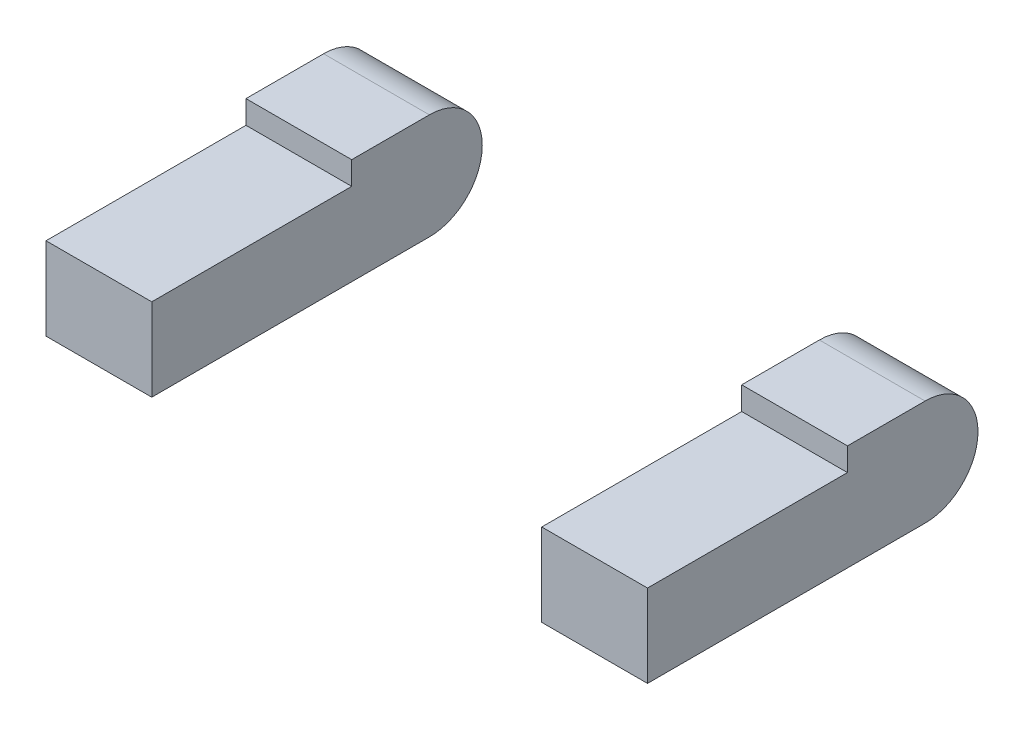
ISO-10303-21;
HEADER;
FILE_DESCRIPTION(('STEP AP214'),'2;1');
FILE_NAME('part.step','',(''),(''),'','','');
FILE_SCHEMA(('AUTOMOTIVE_DESIGN { 1 0 10303 214 1 1 1 1 }'));
ENDSEC;
DATA;
#1=APPLICATION_CONTEXT('core data for automotive mechanical design processes');
#2=APPLICATION_PROTOCOL_DEFINITION('international standard','automotive_design',2000,#1);
#3=PRODUCT_CONTEXT('',#1,'mechanical');
#4=PRODUCT('Part','Part','',(#3));
#5=PRODUCT_RELATED_PRODUCT_CATEGORY('part','',(#4));
#6=PRODUCT_DEFINITION_FORMATION('','',#4);
#7=PRODUCT_DEFINITION_CONTEXT('part definition',#1,'design');
#8=PRODUCT_DEFINITION('design','',#6,#7);
#9=PRODUCT_DEFINITION_SHAPE('','',#8);
#10=(LENGTH_UNIT() NAMED_UNIT(*) SI_UNIT(.MILLI.,.METRE.));
#11=(NAMED_UNIT(*) PLANE_ANGLE_UNIT() SI_UNIT($,.RADIAN.));
#12=(NAMED_UNIT(*) SI_UNIT($,.STERADIAN.) SOLID_ANGLE_UNIT());
#13=UNCERTAINTY_MEASURE_WITH_UNIT(LENGTH_MEASURE(1.E-05),#10,'distance_accuracy_value','');
#14=(GEOMETRIC_REPRESENTATION_CONTEXT(3) GLOBAL_UNCERTAINTY_ASSIGNED_CONTEXT((#13)) GLOBAL_UNIT_ASSIGNED_CONTEXT((#10,
#11,#12)) REPRESENTATION_CONTEXT('',''));
#15=CARTESIAN_POINT('',(0.,0.,0.));
#16=DIRECTION('',(0.,0.,1.));
#17=DIRECTION('',(1.,0.,0.));
#18=AXIS2_PLACEMENT_3D('',#15,#16,#17);
#19=CARTESIAN_POINT('',(1.82,-1.82,-3.745));
#20=DIRECTION('',(0.,0.,1.));
#21=DIRECTION('',(1.,0.,0.));
#22=AXIS2_PLACEMENT_3D('',#19,#20,#21);
#23=PLANE('',#22);
#24=DIRECTION('',(0.,-1.,0.));
#25=VECTOR('',#24,1.);
#26=CARTESIAN_POINT('',(1.82,-3.43,-3.745));
#27=LINE('',#26,#25);
#28=CARTESIAN_POINT('',(1.82,-3.43,-3.745));
#29=VERTEX_POINT('',#28);
#30=CARTESIAN_POINT('',(1.82,-3.93,-3.745));
#31=VERTEX_POINT('',#30);
#32=EDGE_CURVE('P0_E97',#29,#31,#27,.T.);
#33=ORIENTED_EDGE('',*,*,#32,.F.);
#34=DIRECTION('',(1.,0.,0.));
#35=VECTOR('',#34,1.);
#36=CARTESIAN_POINT('',(1.18,-3.43,-3.745));
#37=LINE('',#36,#35);
#38=CARTESIAN_POINT('',(1.18,-3.43,-3.745));
#39=VERTEX_POINT('',#38);
#40=EDGE_CURVE('P0_E119',#39,#29,#37,.T.);
#41=ORIENTED_EDGE('',*,*,#40,.F.);
#42=DIRECTION('',(0.,-1.,0.));
#43=VECTOR('',#42,1.);
#44=CARTESIAN_POINT('',(1.18,-3.43,-3.745));
#45=LINE('',#44,#43);
#46=CARTESIAN_POINT('',(1.18,-3.93,-3.745));
#47=VERTEX_POINT('',#46);
#48=EDGE_CURVE('P0_E73',#39,#47,#45,.T.);
#49=ORIENTED_EDGE('',*,*,#48,.T.);
#50=DIRECTION('',(-1.,0.,0.));
#51=VECTOR('',#50,1.);
#52=CARTESIAN_POINT('',(1.82,-3.93,-3.745));
#53=LINE('',#52,#51);
#54=EDGE_CURVE('P0_E11',#31,#47,#53,.T.);
#55=ORIENTED_EDGE('',*,*,#54,.F.);
#56=EDGE_LOOP('',(#33,#41,#49,#55));
#57=FACE_BOUND('',#56,.T.);
#58=ADVANCED_FACE('P0_F17',(#57),#23,.T.);
#59=CARTESIAN_POINT('',(1.82,-3.93,-3.745));
#60=DIRECTION('',(0.,-1.,0.));
#61=DIRECTION('',(0.,0.,-1.));
#62=AXIS2_PLACEMENT_3D('',#59,#60,#61);
#63=PLANE('',#62);
#64=DIRECTION('',(0.,0.,-1.));
#65=VECTOR('',#64,1.);
#66=CARTESIAN_POINT('',(1.82,-3.93,-3.745));
#67=LINE('',#66,#65);
#68=CARTESIAN_POINT('',(1.82,-3.93,-5.425));
#69=VERTEX_POINT('',#68);
#70=EDGE_CURVE('P0_E90',#31,#69,#67,.T.);
#71=ORIENTED_EDGE('',*,*,#70,.F.);
#72=ORIENTED_EDGE('',*,*,#54,.T.);
#73=DIRECTION('',(0.,0.,-1.));
#74=VECTOR('',#73,1.);
#75=CARTESIAN_POINT('',(1.18,-3.93,-3.745));
#76=LINE('',#75,#74);
#77=CARTESIAN_POINT('',(1.18,-3.93,-5.425));
#78=VERTEX_POINT('',#77);
#79=EDGE_CURVE('P0_E105',#47,#78,#76,.T.);
#80=ORIENTED_EDGE('',*,*,#79,.T.);
#81=DIRECTION('',(-1.,0.,0.));
#82=VECTOR('',#81,1.);
#83=CARTESIAN_POINT('',(1.82,-3.93,-5.425));
#84=LINE('',#83,#82);
#85=EDGE_CURVE('P0_E27',#69,#78,#84,.T.);
#86=ORIENTED_EDGE('',*,*,#85,.F.);
#87=EDGE_LOOP('',(#71,#72,#80,#86));
#88=FACE_BOUND('',#87,.T.);
#89=ADVANCED_FACE('P0_F19',(#88),#63,.T.);
#90=CARTESIAN_POINT('',(1.82,-3.61,-5.425));
#91=DIRECTION('',(1.,0.,0.));
#92=DIRECTION('',(0.,0.,-1.));
#93=AXIS2_PLACEMENT_3D('',#90,#91,#92);
#94=CYLINDRICAL_SURFACE('',#93,0.32);
#95=CARTESIAN_POINT('',(1.82,-3.61,-5.425));
#96=DIRECTION('',(1.,0.,0.));
#97=DIRECTION('',(0.,-1.,0.));
#98=AXIS2_PLACEMENT_3D('',#95,#96,#97);
#99=CIRCLE('',#98,0.32);
#100=CARTESIAN_POINT('',(1.82,-3.29,-5.425));
#101=VERTEX_POINT('',#100);
#102=EDGE_CURVE('P0_E65',#69,#101,#99,.T.);
#103=ORIENTED_EDGE('',*,*,#102,.F.);
#104=ORIENTED_EDGE('',*,*,#85,.T.);
#105=CARTESIAN_POINT('',(1.18,-3.61,-5.425));
#106=DIRECTION('',(1.,0.,0.));
#107=DIRECTION('',(0.,-1.,0.));
#108=AXIS2_PLACEMENT_3D('',#105,#106,#107);
#109=CIRCLE('',#108,0.32);
#110=CARTESIAN_POINT('',(1.18,-3.29,-5.425));
#111=VERTEX_POINT('',#110);
#112=EDGE_CURVE('P0_E68',#78,#111,#109,.T.);
#113=ORIENTED_EDGE('',*,*,#112,.T.);
#114=DIRECTION('',(-1.,0.,0.));
#115=VECTOR('',#114,1.);
#116=CARTESIAN_POINT('',(1.82,-3.29,-5.425));
#117=LINE('',#116,#115);
#118=EDGE_CURVE('P0_E61',#101,#111,#117,.T.);
#119=ORIENTED_EDGE('',*,*,#118,.F.);
#120=EDGE_LOOP('',(#103,#104,#113,#119));
#121=FACE_BOUND('',#120,.T.);
#122=ADVANCED_FACE('P0_F63',(#121),#94,.T.);
#123=CARTESIAN_POINT('',(1.82,-3.29,-5.425));
#124=DIRECTION('',(0.,1.,0.));
#125=DIRECTION('',(1.,0.,0.));
#126=AXIS2_PLACEMENT_3D('',#123,#124,#125);
#127=PLANE('',#126);
#128=DIRECTION('',(0.,0.,1.));
#129=VECTOR('',#128,1.);
#130=CARTESIAN_POINT('',(1.82,-3.29,-5.425));
#131=LINE('',#130,#129);
#132=CARTESIAN_POINT('',(1.82,-3.29,-4.955));
#133=VERTEX_POINT('',#132);
#134=EDGE_CURVE('P0_E77',#101,#133,#131,.T.);
#135=ORIENTED_EDGE('',*,*,#134,.F.);
#136=ORIENTED_EDGE('',*,*,#118,.T.);
#137=DIRECTION('',(0.,0.,1.));
#138=VECTOR('',#137,1.);
#139=CARTESIAN_POINT('',(1.18,-3.29,-5.425));
#140=LINE('',#139,#138);
#141=CARTESIAN_POINT('',(1.18,-3.29,-4.955));
#142=VERTEX_POINT('',#141);
#143=EDGE_CURVE('P0_E85',#111,#142,#140,.T.);
#144=ORIENTED_EDGE('',*,*,#143,.T.);
#145=DIRECTION('',(1.,0.,0.));
#146=VECTOR('',#145,1.);
#147=CARTESIAN_POINT('',(1.18,-3.29,-4.955));
#148=LINE('',#147,#146);
#149=EDGE_CURVE('P0_E80',#142,#133,#148,.T.);
#150=ORIENTED_EDGE('',*,*,#149,.T.);
#151=EDGE_LOOP('',(#135,#136,#144,#150));
#152=FACE_BOUND('',#151,.T.);
#153=ADVANCED_FACE('P0_F78',(#152),#127,.T.);
#154=CARTESIAN_POINT('',(1.18,0.,0.));
#155=DIRECTION('',(1.,0.,0.));
#156=DIRECTION('',(0.,1.,0.));
#157=AXIS2_PLACEMENT_3D('',#154,#155,#156);
#158=PLANE('',#157);
#159=DIRECTION('',(0.,1.,0.));
#160=VECTOR('',#159,1.);
#161=CARTESIAN_POINT('',(1.18,-3.43,-4.955));
#162=LINE('',#161,#160);
#163=CARTESIAN_POINT('',(1.18,-3.43,-4.955));
#164=VERTEX_POINT('',#163);
#165=EDGE_CURVE('P0_E133',#164,#142,#162,.T.);
#166=ORIENTED_EDGE('',*,*,#165,.T.);
#167=ORIENTED_EDGE('',*,*,#143,.F.);
#168=ORIENTED_EDGE('',*,*,#112,.F.);
#169=ORIENTED_EDGE('',*,*,#79,.F.);
#170=ORIENTED_EDGE('',*,*,#48,.F.);
#171=DIRECTION('',(0.,0.,1.));
#172=VECTOR('',#171,1.);
#173=CARTESIAN_POINT('',(1.18,-3.43,-4.955));
#174=LINE('',#173,#172);
#175=EDGE_CURVE('P0_E118',#164,#39,#174,.T.);
#176=ORIENTED_EDGE('',*,*,#175,.F.);
#177=EDGE_LOOP('',(#166,#167,#168,#169,#170,#176));
#178=FACE_BOUND('',#177,.T.);
#179=ADVANCED_FACE('P0_F111',(#178),#158,.F.);
#180=CARTESIAN_POINT('',(1.82,0.,0.));
#181=DIRECTION('',(1.,0.,0.));
#182=DIRECTION('',(0.,1.,0.));
#183=AXIS2_PLACEMENT_3D('',#180,#181,#182);
#184=PLANE('',#183);
#185=DIRECTION('',(0.,0.,1.));
#186=VECTOR('',#185,1.);
#187=CARTESIAN_POINT('',(1.82,-3.43,-4.955));
#188=LINE('',#187,#186);
#189=CARTESIAN_POINT('',(1.82,-3.43,-4.955));
#190=VERTEX_POINT('',#189);
#191=EDGE_CURVE('P0_E123',#190,#29,#188,.T.);
#192=ORIENTED_EDGE('',*,*,#191,.T.);
#193=ORIENTED_EDGE('',*,*,#32,.T.);
#194=ORIENTED_EDGE('',*,*,#70,.T.);
#195=ORIENTED_EDGE('',*,*,#102,.T.);
#196=ORIENTED_EDGE('',*,*,#134,.T.);
#197=DIRECTION('',(0.,1.,0.));
#198=VECTOR('',#197,1.);
#199=CARTESIAN_POINT('',(1.82,-3.43,-4.955));
#200=LINE('',#199,#198);
#201=EDGE_CURVE('P0_E126',#190,#133,#200,.T.);
#202=ORIENTED_EDGE('',*,*,#201,.F.);
#203=EDGE_LOOP('',(#192,#193,#194,#195,#196,#202));
#204=FACE_BOUND('',#203,.T.);
#205=ADVANCED_FACE('P0_F88',(#204),#184,.T.);
#206=CARTESIAN_POINT('',(1.82,-3.43,-4.955));
#207=DIRECTION('',(0.,0.,1.));
#208=DIRECTION('',(1.,0.,0.));
#209=AXIS2_PLACEMENT_3D('',#206,#207,#208);
#210=PLANE('',#209);
#211=ORIENTED_EDGE('',*,*,#165,.F.);
#212=DIRECTION('',(-1.,0.,0.));
#213=VECTOR('',#212,1.);
#214=CARTESIAN_POINT('',(1.82,-3.43,-4.955));
#215=LINE('',#214,#213);
#216=EDGE_CURVE('P0_E129',#190,#164,#215,.T.);
#217=ORIENTED_EDGE('',*,*,#216,.F.);
#218=ORIENTED_EDGE('',*,*,#201,.T.);
#219=ORIENTED_EDGE('',*,*,#149,.F.);
#220=EDGE_LOOP('',(#211,#217,#218,#219));
#221=FACE_BOUND('',#220,.T.);
#222=ADVANCED_FACE('P0_F169',(#221),#210,.T.);
#223=CARTESIAN_POINT('',(1.82,-3.43,-3.745));
#224=DIRECTION('',(0.,1.,0.));
#225=DIRECTION('',(1.,0.,0.));
#226=AXIS2_PLACEMENT_3D('',#223,#224,#225);
#227=PLANE('',#226);
#228=ORIENTED_EDGE('',*,*,#175,.T.);
#229=ORIENTED_EDGE('',*,*,#40,.T.);
#230=ORIENTED_EDGE('',*,*,#191,.F.);
#231=ORIENTED_EDGE('',*,*,#216,.T.);
#232=EDGE_LOOP('',(#228,#229,#230,#231));
#233=FACE_BOUND('',#232,.T.);
#234=ADVANCED_FACE('P0_F173',(#233),#227,.T.);
#235=CLOSED_SHELL('',(#58,#89,#122,#153,#179,#205,#222,#234));
#236=MANIFOLD_SOLID_BREP('P0_B1',#235);
#237=CARTESIAN_POINT('',(1.82,-3.43,-3.745));
#238=DIRECTION('',(0.,1.,0.));
#239=DIRECTION('',(1.,0.,0.));
#240=AXIS2_PLACEMENT_3D('',#237,#238,#239);
#241=PLANE('',#240);
#242=DIRECTION('',(0.,0.,1.));
#243=VECTOR('',#242,1.);
#244=CARTESIAN_POINT('',(-1.18,-3.43,-4.955));
#245=LINE('',#244,#243);
#246=CARTESIAN_POINT('',(-1.18,-3.43,-4.955));
#247=VERTEX_POINT('',#246);
#248=CARTESIAN_POINT('',(-1.18,-3.43,-3.745));
#249=VERTEX_POINT('',#248);
#250=EDGE_CURVE('P1_E133',#247,#249,#245,.T.);
#251=ORIENTED_EDGE('',*,*,#250,.F.);
#252=DIRECTION('',(-1.,0.,0.));
#253=VECTOR('',#252,1.);
#254=CARTESIAN_POINT('',(1.82,-3.43,-4.955));
#255=LINE('',#254,#253);
#256=CARTESIAN_POINT('',(-1.82,-3.43,-4.955));
#257=VERTEX_POINT('',#256);
#258=EDGE_CURVE('P1_E11',#247,#257,#255,.T.);
#259=ORIENTED_EDGE('',*,*,#258,.T.);
#260=DIRECTION('',(0.,0.,1.));
#261=VECTOR('',#260,1.);
#262=CARTESIAN_POINT('',(-1.82,-3.43,-4.955));
#263=LINE('',#262,#261);
#264=CARTESIAN_POINT('',(-1.82,-3.43,-3.745));
#265=VERTEX_POINT('',#264);
#266=EDGE_CURVE('P1_E66',#257,#265,#263,.T.);
#267=ORIENTED_EDGE('',*,*,#266,.T.);
#268=DIRECTION('',(1.,0.,0.));
#269=VECTOR('',#268,1.);
#270=CARTESIAN_POINT('',(-1.82,-3.43,-3.745));
#271=LINE('',#270,#269);
#272=EDGE_CURVE('P1_E105',#265,#249,#271,.T.);
#273=ORIENTED_EDGE('',*,*,#272,.T.);
#274=EDGE_LOOP('',(#251,#259,#267,#273));
#275=FACE_BOUND('',#274,.T.);
#276=ADVANCED_FACE('P1_F17',(#275),#241,.T.);
#277=CARTESIAN_POINT('',(1.82,-3.43,-4.955));
#278=DIRECTION('',(0.,0.,1.));
#279=DIRECTION('',(1.,0.,0.));
#280=AXIS2_PLACEMENT_3D('',#277,#278,#279);
#281=PLANE('',#280);
#282=DIRECTION('',(0.,1.,0.));
#283=VECTOR('',#282,1.);
#284=CARTESIAN_POINT('',(-1.18,-3.43,-4.955));
#285=LINE('',#284,#283);
#286=CARTESIAN_POINT('',(-1.18,-3.29,-4.955));
#287=VERTEX_POINT('',#286);
#288=EDGE_CURVE('P1_E140',#247,#287,#285,.T.);
#289=ORIENTED_EDGE('',*,*,#288,.T.);
#290=DIRECTION('',(1.,0.,0.));
#291=VECTOR('',#290,1.);
#292=CARTESIAN_POINT('',(-1.82,-3.29,-4.955));
#293=LINE('',#292,#291);
#294=CARTESIAN_POINT('',(-1.82,-3.29,-4.955));
#295=VERTEX_POINT('',#294);
#296=EDGE_CURVE('P1_E26',#295,#287,#293,.T.);
#297=ORIENTED_EDGE('',*,*,#296,.F.);
#298=DIRECTION('',(0.,1.,0.));
#299=VECTOR('',#298,1.);
#300=CARTESIAN_POINT('',(-1.82,-3.43,-4.955));
#301=LINE('',#300,#299);
#302=EDGE_CURVE('P1_E134',#257,#295,#301,.T.);
#303=ORIENTED_EDGE('',*,*,#302,.F.);
#304=ORIENTED_EDGE('',*,*,#258,.F.);
#305=EDGE_LOOP('',(#289,#297,#303,#304));
#306=FACE_BOUND('',#305,.T.);
#307=ADVANCED_FACE('P1_F224',(#306),#281,.T.);
#308=CARTESIAN_POINT('',(-1.18,-3.29,-5.425));
#309=DIRECTION('',(0.,1.,0.));
#310=DIRECTION('',(1.,0.,0.));
#311=AXIS2_PLACEMENT_3D('',#308,#309,#310);
#312=PLANE('',#311);
#313=DIRECTION('',(0.,0.,1.));
#314=VECTOR('',#313,1.);
#315=CARTESIAN_POINT('',(-1.18,-3.29,-5.425));
#316=LINE('',#315,#314);
#317=CARTESIAN_POINT('',(-1.18,-3.29,-5.425));
#318=VERTEX_POINT('',#317);
#319=EDGE_CURVE('P1_E139',#318,#287,#316,.T.);
#320=ORIENTED_EDGE('',*,*,#319,.F.);
#321=DIRECTION('',(-1.,0.,0.));
#322=VECTOR('',#321,1.);
#323=CARTESIAN_POINT('',(-1.18,-3.29,-5.425));
#324=LINE('',#323,#322);
#325=CARTESIAN_POINT('',(-1.82,-3.29,-5.425));
#326=VERTEX_POINT('',#325);
#327=EDGE_CURVE('P1_E125',#318,#326,#324,.T.);
#328=ORIENTED_EDGE('',*,*,#327,.T.);
#329=DIRECTION('',(0.,0.,1.));
#330=VECTOR('',#329,1.);
#331=CARTESIAN_POINT('',(-1.82,-3.29,-5.425));
#332=LINE('',#331,#330);
#333=EDGE_CURVE('P1_E84',#326,#295,#332,.T.);
#334=ORIENTED_EDGE('',*,*,#333,.T.);
#335=ORIENTED_EDGE('',*,*,#296,.T.);
#336=EDGE_LOOP('',(#320,#328,#334,#335));
#337=FACE_BOUND('',#336,.T.);
#338=ADVANCED_FACE('P1_F222',(#337),#312,.T.);
#339=CARTESIAN_POINT('',(-1.18,0.,0.));
#340=DIRECTION('',(1.,0.,0.));
#341=DIRECTION('',(0.,1.,0.));
#342=AXIS2_PLACEMENT_3D('',#339,#340,#341);
#343=PLANE('',#342);
#344=ORIENTED_EDGE('',*,*,#250,.T.);
#345=DIRECTION('',(0.,-1.,0.));
#346=VECTOR('',#345,1.);
#347=CARTESIAN_POINT('',(-1.18,-3.43,-3.745));
#348=LINE('',#347,#346);
#349=CARTESIAN_POINT('',(-1.18,-3.93,-3.745));
#350=VERTEX_POINT('',#349);
#351=EDGE_CURVE('P1_E91',#249,#350,#348,.T.);
#352=ORIENTED_EDGE('',*,*,#351,.T.);
#353=DIRECTION('',(0.,0.,-1.));
#354=VECTOR('',#353,1.);
#355=CARTESIAN_POINT('',(-1.18,-3.93,-3.745));
#356=LINE('',#355,#354);
#357=CARTESIAN_POINT('',(-1.18,-3.93,-5.425));
#358=VERTEX_POINT('',#357);
#359=EDGE_CURVE('P1_E118',#350,#358,#356,.T.);
#360=ORIENTED_EDGE('',*,*,#359,.T.);
#361=CARTESIAN_POINT('',(-1.18,-3.61,-5.425));
#362=DIRECTION('',(1.,0.,0.));
#363=DIRECTION('',(0.,-1.,0.));
#364=AXIS2_PLACEMENT_3D('',#361,#362,#363);
#365=CIRCLE('',#364,0.32);
#366=EDGE_CURVE('P1_E207',#358,#318,#365,.T.);
#367=ORIENTED_EDGE('',*,*,#366,.T.);
#368=ORIENTED_EDGE('',*,*,#319,.T.);
#369=ORIENTED_EDGE('',*,*,#288,.F.);
#370=EDGE_LOOP('',(#344,#352,#360,#367,#368,#369));
#371=FACE_BOUND('',#370,.T.);
#372=ADVANCED_FACE('P1_F216',(#371),#343,.T.);
#373=CARTESIAN_POINT('',(-1.82,0.,0.));
#374=DIRECTION('',(1.,0.,0.));
#375=DIRECTION('',(0.,1.,0.));
#376=AXIS2_PLACEMENT_3D('',#373,#374,#375);
#377=PLANE('',#376);
#378=ORIENTED_EDGE('',*,*,#266,.F.);
#379=ORIENTED_EDGE('',*,*,#302,.T.);
#380=ORIENTED_EDGE('',*,*,#333,.F.);
#381=CARTESIAN_POINT('',(-1.82,-3.61,-5.425));
#382=DIRECTION('',(1.,0.,0.));
#383=DIRECTION('',(0.,-1.,0.));
#384=AXIS2_PLACEMENT_3D('',#381,#382,#383);
#385=CIRCLE('',#384,0.32);
#386=CARTESIAN_POINT('',(-1.82,-3.93,-5.425));
#387=VERTEX_POINT('',#386);
#388=EDGE_CURVE('P1_E111',#387,#326,#385,.T.);
#389=ORIENTED_EDGE('',*,*,#388,.F.);
#390=DIRECTION('',(0.,0.,-1.));
#391=VECTOR('',#390,1.);
#392=CARTESIAN_POINT('',(-1.82,-3.93,-3.745));
#393=LINE('',#392,#391);
#394=CARTESIAN_POINT('',(-1.82,-3.93,-3.745));
#395=VERTEX_POINT('',#394);
#396=EDGE_CURVE('P1_E108',#395,#387,#393,.T.);
#397=ORIENTED_EDGE('',*,*,#396,.F.);
#398=DIRECTION('',(0.,-1.,0.));
#399=VECTOR('',#398,1.);
#400=CARTESIAN_POINT('',(-1.82,-3.43,-3.745));
#401=LINE('',#400,#399);
#402=EDGE_CURVE('P1_E99',#265,#395,#401,.T.);
#403=ORIENTED_EDGE('',*,*,#402,.F.);
#404=EDGE_LOOP('',(#378,#379,#380,#389,#397,#403));
#405=FACE_BOUND('',#404,.T.);
#406=ADVANCED_FACE('P1_F109',(#405),#377,.F.);
#407=CARTESIAN_POINT('',(-1.18,-1.82,-3.745));
#408=DIRECTION('',(0.,0.,1.));
#409=DIRECTION('',(1.,0.,0.));
#410=AXIS2_PLACEMENT_3D('',#407,#408,#409);
#411=PLANE('',#410);
#412=ORIENTED_EDGE('',*,*,#351,.F.);
#413=ORIENTED_EDGE('',*,*,#272,.F.);
#414=ORIENTED_EDGE('',*,*,#402,.T.);
#415=DIRECTION('',(-1.,0.,0.));
#416=VECTOR('',#415,1.);
#417=CARTESIAN_POINT('',(-1.18,-3.93,-3.745));
#418=LINE('',#417,#416);
#419=EDGE_CURVE('P1_E103',#350,#395,#418,.T.);
#420=ORIENTED_EDGE('',*,*,#419,.F.);
#421=EDGE_LOOP('',(#412,#413,#414,#420));
#422=FACE_BOUND('',#421,.T.);
#423=ADVANCED_FACE('P1_F101',(#422),#411,.T.);
#424=CARTESIAN_POINT('',(-1.18,-3.93,-3.745));
#425=DIRECTION('',(0.,-1.,0.));
#426=DIRECTION('',(0.,0.,-1.));
#427=AXIS2_PLACEMENT_3D('',#424,#425,#426);
#428=PLANE('',#427);
#429=ORIENTED_EDGE('',*,*,#359,.F.);
#430=ORIENTED_EDGE('',*,*,#419,.T.);
#431=ORIENTED_EDGE('',*,*,#396,.T.);
#432=DIRECTION('',(-1.,0.,0.));
#433=VECTOR('',#432,1.);
#434=CARTESIAN_POINT('',(-1.18,-3.93,-5.425));
#435=LINE('',#434,#433);
#436=EDGE_CURVE('P1_E201',#358,#387,#435,.T.);
#437=ORIENTED_EDGE('',*,*,#436,.F.);
#438=EDGE_LOOP('',(#429,#430,#431,#437));
#439=FACE_BOUND('',#438,.T.);
#440=ADVANCED_FACE('P1_F117',(#439),#428,.T.);
#441=CARTESIAN_POINT('',(-1.18,-3.61,-5.425));
#442=DIRECTION('',(1.,0.,0.));
#443=DIRECTION('',(0.,0.,-1.));
#444=AXIS2_PLACEMENT_3D('',#441,#442,#443);
#445=CYLINDRICAL_SURFACE('',#444,0.32);
#446=ORIENTED_EDGE('',*,*,#366,.F.);
#447=ORIENTED_EDGE('',*,*,#436,.T.);
#448=ORIENTED_EDGE('',*,*,#388,.T.);
#449=ORIENTED_EDGE('',*,*,#327,.F.);
#450=EDGE_LOOP('',(#446,#447,#448,#449));
#451=FACE_BOUND('',#450,.T.);
#452=ADVANCED_FACE('P1_F220',(#451),#445,.T.);
#453=CLOSED_SHELL('',(#276,#307,#338,#372,#406,#423,#440,#452));
#454=MANIFOLD_SOLID_BREP('P1_B1',#453);
#455=ADVANCED_BREP_SHAPE_REPRESENTATION('',(#18,#236,#454),#14);
#456=SHAPE_DEFINITION_REPRESENTATION(#9,#455);
ENDSEC;
END-ISO-10303-21;
